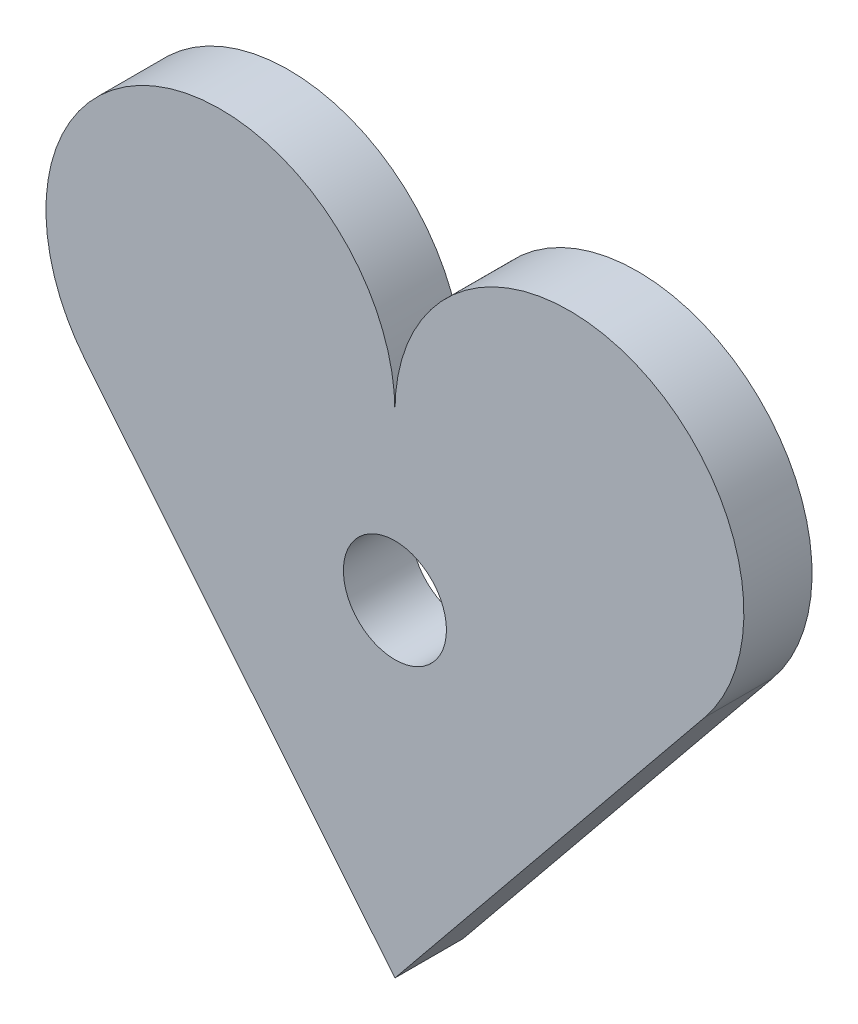
ISO-10303-21;
HEADER;
FILE_DESCRIPTION(('STEP AP214'),'2;1');
FILE_NAME('part.step','',(''),(''),'','','');
FILE_SCHEMA(('AUTOMOTIVE_DESIGN { 1 0 10303 214 1 1 1 1 }'));
ENDSEC;
DATA;
#1=APPLICATION_CONTEXT('core data for automotive mechanical design processes');
#2=APPLICATION_PROTOCOL_DEFINITION('international standard','automotive_design',2000,#1);
#3=PRODUCT_CONTEXT('',#1,'mechanical');
#4=PRODUCT('Part','Part','',(#3));
#5=PRODUCT_RELATED_PRODUCT_CATEGORY('part','',(#4));
#6=PRODUCT_DEFINITION_FORMATION('','',#4);
#7=PRODUCT_DEFINITION_CONTEXT('part definition',#1,'design');
#8=PRODUCT_DEFINITION('design','',#6,#7);
#9=PRODUCT_DEFINITION_SHAPE('','',#8);
#10=(LENGTH_UNIT() NAMED_UNIT(*) SI_UNIT(.MILLI.,.METRE.));
#11=(NAMED_UNIT(*) PLANE_ANGLE_UNIT() SI_UNIT($,.RADIAN.));
#12=(NAMED_UNIT(*) SI_UNIT($,.STERADIAN.) SOLID_ANGLE_UNIT());
#13=UNCERTAINTY_MEASURE_WITH_UNIT(LENGTH_MEASURE(1.E-05),#10,'distance_accuracy_value','');
#14=(GEOMETRIC_REPRESENTATION_CONTEXT(3) GLOBAL_UNCERTAINTY_ASSIGNED_CONTEXT((#13)) GLOBAL_UNIT_ASSIGNED_CONTEXT((#10,
#11,#12)) REPRESENTATION_CONTEXT('',''));
#15=CARTESIAN_POINT('',(0.,0.,0.));
#16=DIRECTION('',(0.,0.,1.));
#17=DIRECTION('',(1.,0.,0.));
#18=AXIS2_PLACEMENT_3D('',#15,#16,#17);
#19=CARTESIAN_POINT('',(-0.276718364532554,90.8779972211097,10.795));
#20=DIRECTION('',(0.,0.,-1.));
#21=DIRECTION('',(-1.,0.,0.));
#22=AXIS2_PLACEMENT_3D('',#19,#20,#21);
#23=PLANE('',#22);
#24=CARTESIAN_POINT('',(-0.276718364532554,90.8779972211097,10.795));
#25=DIRECTION('',(0.,0.,1.));
#26=DIRECTION('',(-1.,0.,0.));
#27=AXIS2_PLACEMENT_3D('',#24,#25,#26);
#28=CIRCLE('',#27,8.128);
#29=CARTESIAN_POINT('',(7.85128163546744,90.8779972211097,10.795));
#30=VERTEX_POINT('',#29);
#31=CARTESIAN_POINT('',(-6.58028346755754,85.7467740733675,10.795));
#32=VERTEX_POINT('',#31);
#33=EDGE_CURVE('E89',#30,#32,#28,.T.);
#34=ORIENTED_EDGE('',*,*,#33,.T.);
#35=DIRECTION('',(0.631302060499781,-0.775537045155633,0.));
#36=VECTOR('',#35,1.);
#37=CARTESIAN_POINT('',(-6.58028346755754,85.7467740733675,10.795));
#38=LINE('',#37,#36);
#39=CARTESIAN_POINT('',(7.85128163546745,68.0179972211097,10.795));
#40=VERTEX_POINT('',#39);
#41=EDGE_CURVE('E84',#32,#40,#38,.T.);
#42=ORIENTED_EDGE('',*,*,#41,.T.);
#43=DIRECTION('',(0.631302060499781,0.775537045155633,0.));
#44=VECTOR('',#43,1.);
#45=CARTESIAN_POINT('',(7.85128163546745,68.0179972211097,10.795));
#46=LINE('',#45,#44);
#47=CARTESIAN_POINT('',(22.2828467384924,85.7467740733675,10.795));
#48=VERTEX_POINT('',#47);
#49=EDGE_CURVE('E87',#40,#48,#46,.T.);
#50=ORIENTED_EDGE('',*,*,#49,.T.);
#51=CARTESIAN_POINT('',(15.9792816354674,90.8779972211097,10.795));
#52=DIRECTION('',(0.,0.,1.));
#53=DIRECTION('',(-1.,0.,0.));
#54=AXIS2_PLACEMENT_3D('',#51,#52,#53);
#55=CIRCLE('',#54,8.128);
#56=EDGE_CURVE('E54',#48,#30,#55,.T.);
#57=ORIENTED_EDGE('',*,*,#56,.T.);
#58=EDGE_LOOP('',(#34,#42,#50,#57));
#59=FACE_BOUND('',#58,.T.);
#60=CARTESIAN_POINT('',(7.85128163546744,83.2579972211097,10.795));
#61=DIRECTION('',(0.,0.,1.));
#62=DIRECTION('',(1.,0.,0.));
#63=AXIS2_PLACEMENT_3D('',#60,#61,#62);
#64=CIRCLE('',#63,2.4);
#65=CARTESIAN_POINT('',(10.2512816354674,83.2579972211097,10.795));
#66=VERTEX_POINT('',#65);
#67=EDGE_CURVE('E104',#66,#66,#64,.T.);
#68=ORIENTED_EDGE('',*,*,#67,.F.);
#69=EDGE_LOOP('',(#68));
#70=FACE_BOUND('',#69,.T.);
#71=ADVANCED_FACE('F37',(#59,#70),#23,.F.);
#72=CARTESIAN_POINT('',(-0.276718364532554,90.8779972211097,7.62));
#73=DIRECTION('',(0.,0.,-1.));
#74=DIRECTION('',(-1.,0.,0.));
#75=AXIS2_PLACEMENT_3D('',#72,#73,#74);
#76=PLANE('',#75);
#77=CARTESIAN_POINT('',(-0.276718364532554,90.8779972211097,7.62));
#78=DIRECTION('',(0.,0.,1.));
#79=DIRECTION('',(-1.,0.,0.));
#80=AXIS2_PLACEMENT_3D('',#77,#78,#79);
#81=CIRCLE('',#80,8.128);
#82=CARTESIAN_POINT('',(7.85128163546744,90.8779972211097,7.62));
#83=VERTEX_POINT('',#82);
#84=CARTESIAN_POINT('',(-6.58028346755754,85.7467740733675,7.62));
#85=VERTEX_POINT('',#84);
#86=EDGE_CURVE('E101',#83,#85,#81,.T.);
#87=ORIENTED_EDGE('',*,*,#86,.F.);
#88=CARTESIAN_POINT('',(15.9792816354674,90.8779972211097,7.62));
#89=DIRECTION('',(0.,0.,1.));
#90=DIRECTION('',(-1.,0.,0.));
#91=AXIS2_PLACEMENT_3D('',#88,#89,#90);
#92=CIRCLE('',#91,8.128);
#93=CARTESIAN_POINT('',(22.2828467384924,85.7467740733675,7.62));
#94=VERTEX_POINT('',#93);
#95=EDGE_CURVE('E77',#94,#83,#92,.T.);
#96=ORIENTED_EDGE('',*,*,#95,.F.);
#97=DIRECTION('',(0.631302060499781,0.775537045155633,0.));
#98=VECTOR('',#97,1.);
#99=CARTESIAN_POINT('',(7.85128163546745,68.0179972211097,7.62));
#100=LINE('',#99,#98);
#101=CARTESIAN_POINT('',(7.85128163546745,68.0179972211097,7.62));
#102=VERTEX_POINT('',#101);
#103=EDGE_CURVE('E71',#102,#94,#100,.T.);
#104=ORIENTED_EDGE('',*,*,#103,.F.);
#105=DIRECTION('',(0.631302060499781,-0.775537045155633,0.));
#106=VECTOR('',#105,1.);
#107=CARTESIAN_POINT('',(-6.58028346755754,85.7467740733675,7.62));
#108=LINE('',#107,#106);
#109=EDGE_CURVE('E93',#85,#102,#108,.T.);
#110=ORIENTED_EDGE('',*,*,#109,.F.);
#111=EDGE_LOOP('',(#87,#96,#104,#110));
#112=FACE_BOUND('',#111,.T.);
#113=CARTESIAN_POINT('',(7.85128163546744,83.2579972211097,7.62));
#114=DIRECTION('',(0.,0.,1.));
#115=DIRECTION('',(1.,0.,0.));
#116=AXIS2_PLACEMENT_3D('',#113,#114,#115);
#117=CIRCLE('',#116,2.4);
#118=CARTESIAN_POINT('',(10.2512816354674,83.2579972211097,7.62));
#119=VERTEX_POINT('',#118);
#120=EDGE_CURVE('E116',#119,#119,#117,.T.);
#121=ORIENTED_EDGE('',*,*,#120,.T.);
#122=EDGE_LOOP('',(#121));
#123=FACE_BOUND('',#122,.T.);
#124=ADVANCED_FACE('F112',(#112,#123),#76,.T.);
#125=CARTESIAN_POINT('',(-0.276718364532554,90.8779972211097,10.795));
#126=DIRECTION('',(0.,0.,-1.));
#127=DIRECTION('',(-1.,0.,0.));
#128=AXIS2_PLACEMENT_3D('',#125,#126,#127);
#129=CYLINDRICAL_SURFACE('',#128,8.128);
#130=ORIENTED_EDGE('',*,*,#86,.T.);
#131=DIRECTION('',(0.,0.,-1.));
#132=VECTOR('',#131,1.);
#133=CARTESIAN_POINT('',(-6.58028346755754,85.7467740733675,10.795));
#134=LINE('',#133,#132);
#135=EDGE_CURVE('E11',#32,#85,#134,.T.);
#136=ORIENTED_EDGE('',*,*,#135,.F.);
#137=ORIENTED_EDGE('',*,*,#33,.F.);
#138=DIRECTION('',(0.,0.,-1.));
#139=VECTOR('',#138,1.);
#140=CARTESIAN_POINT('',(7.85128163546744,90.8779972211097,10.795));
#141=LINE('',#140,#139);
#142=EDGE_CURVE('E97',#30,#83,#141,.T.);
#143=ORIENTED_EDGE('',*,*,#142,.T.);
#144=EDGE_LOOP('',(#130,#136,#137,#143));
#145=FACE_BOUND('',#144,.T.);
#146=ADVANCED_FACE('F39',(#145),#129,.T.);
#147=CARTESIAN_POINT('',(-6.58028346755754,85.7467740733675,10.795));
#148=DIRECTION('',(0.775537045155633,0.631302060499781,0.));
#149=DIRECTION('',(-0.631302060499781,0.775537045155633,0.));
#150=AXIS2_PLACEMENT_3D('',#147,#148,#149);
#151=PLANE('',#150);
#152=ORIENTED_EDGE('',*,*,#109,.T.);
#153=DIRECTION('',(0.,0.,-1.));
#154=VECTOR('',#153,1.);
#155=CARTESIAN_POINT('',(7.85128163546745,68.0179972211097,10.795));
#156=LINE('',#155,#154);
#157=EDGE_CURVE('E46',#40,#102,#156,.T.);
#158=ORIENTED_EDGE('',*,*,#157,.F.);
#159=ORIENTED_EDGE('',*,*,#41,.F.);
#160=ORIENTED_EDGE('',*,*,#135,.T.);
#161=EDGE_LOOP('',(#152,#158,#159,#160));
#162=FACE_BOUND('',#161,.T.);
#163=ADVANCED_FACE('F92',(#162),#151,.F.);
#164=CARTESIAN_POINT('',(7.85128163546745,68.0179972211097,10.795));
#165=DIRECTION('',(-0.775537045155633,0.631302060499781,0.));
#166=DIRECTION('',(-0.631302060499781,-0.775537045155633,0.));
#167=AXIS2_PLACEMENT_3D('',#164,#165,#166);
#168=PLANE('',#167);
#169=ORIENTED_EDGE('',*,*,#103,.T.);
#170=DIRECTION('',(0.,0.,-1.));
#171=VECTOR('',#170,1.);
#172=CARTESIAN_POINT('',(22.2828467384924,85.7467740733675,10.795));
#173=LINE('',#172,#171);
#174=EDGE_CURVE('E94',#48,#94,#173,.T.);
#175=ORIENTED_EDGE('',*,*,#174,.F.);
#176=ORIENTED_EDGE('',*,*,#49,.F.);
#177=ORIENTED_EDGE('',*,*,#157,.T.);
#178=EDGE_LOOP('',(#169,#175,#176,#177));
#179=FACE_BOUND('',#178,.T.);
#180=ADVANCED_FACE('F95',(#179),#168,.F.);
#181=CARTESIAN_POINT('',(15.9792816354674,90.8779972211097,10.795));
#182=DIRECTION('',(0.,0.,-1.));
#183=DIRECTION('',(-1.,0.,0.));
#184=AXIS2_PLACEMENT_3D('',#181,#182,#183);
#185=CYLINDRICAL_SURFACE('',#184,8.128);
#186=ORIENTED_EDGE('',*,*,#95,.T.);
#187=ORIENTED_EDGE('',*,*,#142,.F.);
#188=ORIENTED_EDGE('',*,*,#56,.F.);
#189=ORIENTED_EDGE('',*,*,#174,.T.);
#190=EDGE_LOOP('',(#186,#187,#188,#189));
#191=FACE_BOUND('',#190,.T.);
#192=ADVANCED_FACE('F109',(#191),#185,.T.);
#193=CARTESIAN_POINT('',(7.85128163546744,83.2579972211097,10.795));
#194=DIRECTION('',(0.,0.,-1.));
#195=DIRECTION('',(-1.,0.,0.));
#196=AXIS2_PLACEMENT_3D('',#193,#194,#195);
#197=CYLINDRICAL_SURFACE('',#196,2.4);
#198=ORIENTED_EDGE('',*,*,#67,.T.);
#199=EDGE_LOOP('',(#198));
#200=FACE_BOUND('',#199,.T.);
#201=ORIENTED_EDGE('',*,*,#120,.F.);
#202=EDGE_LOOP('',(#201));
#203=FACE_BOUND('',#202,.T.);
#204=ADVANCED_FACE('F122',(#200,#203),#197,.F.);
#205=CLOSED_SHELL('',(#71,#124,#146,#163,#180,#192,#204));
#206=MANIFOLD_SOLID_BREP('B2',#205);
#207=ADVANCED_BREP_SHAPE_REPRESENTATION('',(#18,#206),#14);
#208=SHAPE_DEFINITION_REPRESENTATION(#9,#207);
ENDSEC;
END-ISO-10303-21;
